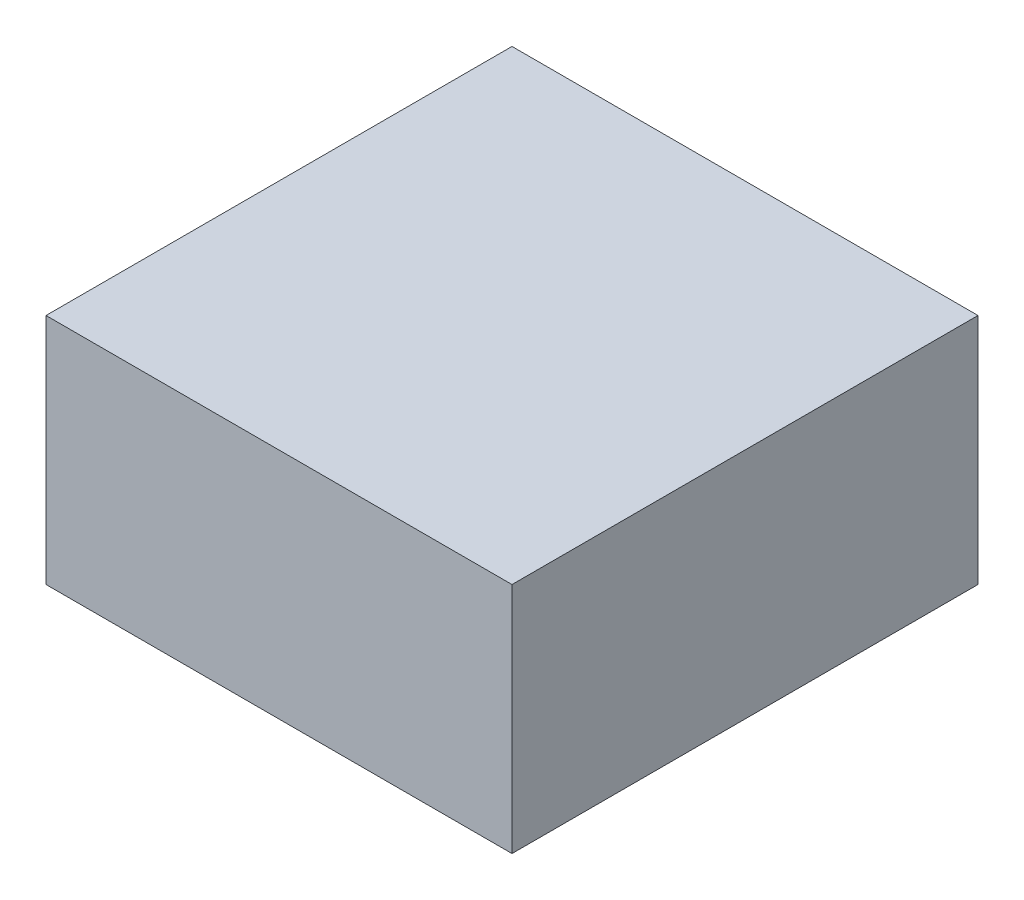
ISO-10303-21;
HEADER;
FILE_DESCRIPTION(('STEP AP214'),'2;1');
FILE_NAME('part.step','',(''),(''),'','','');
FILE_SCHEMA(('AUTOMOTIVE_DESIGN { 1 0 10303 214 1 1 1 1 }'));
ENDSEC;
DATA;
#1=APPLICATION_CONTEXT('core data for automotive mechanical design processes');
#2=APPLICATION_PROTOCOL_DEFINITION('international standard','automotive_design',2000,#1);
#3=PRODUCT_CONTEXT('',#1,'mechanical');
#4=PRODUCT('Part','Part','',(#3));
#5=PRODUCT_RELATED_PRODUCT_CATEGORY('part','',(#4));
#6=PRODUCT_DEFINITION_FORMATION('','',#4);
#7=PRODUCT_DEFINITION_CONTEXT('part definition',#1,'design');
#8=PRODUCT_DEFINITION('design','',#6,#7);
#9=PRODUCT_DEFINITION_SHAPE('','',#8);
#10=(LENGTH_UNIT() NAMED_UNIT(*) SI_UNIT(.MILLI.,.METRE.));
#11=(NAMED_UNIT(*) PLANE_ANGLE_UNIT() SI_UNIT($,.RADIAN.));
#12=(NAMED_UNIT(*) SI_UNIT($,.STERADIAN.) SOLID_ANGLE_UNIT());
#13=UNCERTAINTY_MEASURE_WITH_UNIT(LENGTH_MEASURE(1.E-05),#10,'distance_accuracy_value','');
#14=(GEOMETRIC_REPRESENTATION_CONTEXT(3) GLOBAL_UNCERTAINTY_ASSIGNED_CONTEXT((#13)) GLOBAL_UNIT_ASSIGNED_CONTEXT((#10,
#11,#12)) REPRESENTATION_CONTEXT('',''));
#15=CARTESIAN_POINT('',(0.,0.,0.));
#16=DIRECTION('',(0.,0.,1.));
#17=DIRECTION('',(1.,0.,0.));
#18=AXIS2_PLACEMENT_3D('',#15,#16,#17);
#19=CARTESIAN_POINT('',(40.64,114.947278349685,40.64));
#20=DIRECTION('',(0.,0.,1.));
#21=DIRECTION('',(1.,0.,0.));
#22=AXIS2_PLACEMENT_3D('',#19,#20,#21);
#23=PLANE('',#22);
#24=DIRECTION('',(1.,0.,0.));
#25=VECTOR('',#24,1.);
#26=CARTESIAN_POINT('',(40.64,-38.1,40.64));
#27=LINE('',#26,#25);
#28=CARTESIAN_POINT('',(-40.64,-38.1,40.64));
#29=VERTEX_POINT('',#28);
#30=CARTESIAN_POINT('',(40.64,-38.1,40.64));
#31=VERTEX_POINT('',#30);
#32=EDGE_CURVE('E234',#29,#31,#27,.T.);
#33=ORIENTED_EDGE('',*,*,#32,.T.);
#34=DIRECTION('',(0.,-1.,0.));
#35=VECTOR('',#34,1.);
#36=CARTESIAN_POINT('',(40.64,114.947278349685,40.64));
#37=LINE('',#36,#35);
#38=CARTESIAN_POINT('',(40.64,-43.18,40.64));
#39=VERTEX_POINT('',#38);
#40=EDGE_CURVE('E294',#31,#39,#37,.T.);
#41=ORIENTED_EDGE('',*,*,#40,.T.);
#42=DIRECTION('',(-1.,0.,0.));
#43=VECTOR('',#42,1.);
#44=CARTESIAN_POINT('',(40.64,-43.18,40.64));
#45=LINE('',#44,#43);
#46=CARTESIAN_POINT('',(-40.64,-43.18,40.64));
#47=VERTEX_POINT('',#46);
#48=EDGE_CURVE('E287',#39,#47,#45,.T.);
#49=ORIENTED_EDGE('',*,*,#48,.T.);
#50=DIRECTION('',(0.,-1.,0.));
#51=VECTOR('',#50,1.);
#52=CARTESIAN_POINT('',(-40.64,114.947278349685,40.64));
#53=LINE('',#52,#51);
#54=EDGE_CURVE('E283',#29,#47,#53,.T.);
#55=ORIENTED_EDGE('',*,*,#54,.F.);
#56=EDGE_LOOP('',(#33,#41,#49,#55));
#57=FACE_BOUND('',#56,.T.);
#58=ADVANCED_FACE('F37',(#57),#23,.F.);
#59=CARTESIAN_POINT('',(-40.64,114.947278349685,-40.64));
#60=DIRECTION('',(-1.,0.,0.));
#61=DIRECTION('',(0.,0.,1.));
#62=AXIS2_PLACEMENT_3D('',#59,#60,#61);
#63=PLANE('',#62);
#64=DIRECTION('',(0.,0.,1.));
#65=VECTOR('',#64,1.);
#66=CARTESIAN_POINT('',(-40.64,-38.1,-40.64));
#67=LINE('',#66,#65);
#68=CARTESIAN_POINT('',(-40.64,-38.1,-40.64));
#69=VERTEX_POINT('',#68);
#70=EDGE_CURVE('E62',#69,#29,#67,.T.);
#71=ORIENTED_EDGE('',*,*,#70,.T.);
#72=ORIENTED_EDGE('',*,*,#54,.T.);
#73=DIRECTION('',(0.,0.,-1.));
#74=VECTOR('',#73,1.);
#75=CARTESIAN_POINT('',(-40.64,-43.18,-40.64));
#76=LINE('',#75,#74);
#77=CARTESIAN_POINT('',(-40.64,-43.18,-40.64));
#78=VERTEX_POINT('',#77);
#79=EDGE_CURVE('E284',#47,#78,#76,.T.);
#80=ORIENTED_EDGE('',*,*,#79,.T.);
#81=DIRECTION('',(0.,-1.,0.));
#82=VECTOR('',#81,1.);
#83=CARTESIAN_POINT('',(-40.64,114.947278349685,-40.64));
#84=LINE('',#83,#82);
#85=EDGE_CURVE('E295',#69,#78,#84,.T.);
#86=ORIENTED_EDGE('',*,*,#85,.F.);
#87=EDGE_LOOP('',(#71,#72,#80,#86));
#88=FACE_BOUND('',#87,.T.);
#89=ADVANCED_FACE('F351',(#88),#63,.F.);
#90=CARTESIAN_POINT('',(40.64,114.947278349685,-40.64));
#91=DIRECTION('',(0.,0.,-1.));
#92=DIRECTION('',(-1.,0.,0.));
#93=AXIS2_PLACEMENT_3D('',#90,#91,#92);
#94=PLANE('',#93);
#95=DIRECTION('',(-1.,0.,0.));
#96=VECTOR('',#95,1.);
#97=CARTESIAN_POINT('',(40.64,-38.1,-40.64));
#98=LINE('',#97,#96);
#99=CARTESIAN_POINT('',(40.64,-38.1,-40.64));
#100=VERTEX_POINT('',#99);
#101=EDGE_CURVE('E239',#100,#69,#98,.T.);
#102=ORIENTED_EDGE('',*,*,#101,.T.);
#103=ORIENTED_EDGE('',*,*,#85,.T.);
#104=DIRECTION('',(1.,0.,0.));
#105=VECTOR('',#104,1.);
#106=CARTESIAN_POINT('',(40.64,-43.18,-40.64));
#107=LINE('',#106,#105);
#108=CARTESIAN_POINT('',(40.64,-43.18,-40.64));
#109=VERTEX_POINT('',#108);
#110=EDGE_CURVE('E280',#78,#109,#107,.T.);
#111=ORIENTED_EDGE('',*,*,#110,.T.);
#112=DIRECTION('',(0.,-1.,0.));
#113=VECTOR('',#112,1.);
#114=CARTESIAN_POINT('',(40.64,114.947278349685,-40.64));
#115=LINE('',#114,#113);
#116=EDGE_CURVE('E292',#100,#109,#115,.T.);
#117=ORIENTED_EDGE('',*,*,#116,.F.);
#118=EDGE_LOOP('',(#102,#103,#111,#117));
#119=FACE_BOUND('',#118,.T.);
#120=ADVANCED_FACE('F357',(#119),#94,.F.);
#121=CARTESIAN_POINT('',(40.64,114.947278349685,-40.64));
#122=DIRECTION('',(1.,0.,0.));
#123=DIRECTION('',(0.,0.,-1.));
#124=AXIS2_PLACEMENT_3D('',#121,#122,#123);
#125=PLANE('',#124);
#126=DIRECTION('',(0.,0.,-1.));
#127=VECTOR('',#126,1.);
#128=CARTESIAN_POINT('',(40.64,-38.1,-40.64));
#129=LINE('',#128,#127);
#130=EDGE_CURVE('E232',#31,#100,#129,.T.);
#131=ORIENTED_EDGE('',*,*,#130,.T.);
#132=ORIENTED_EDGE('',*,*,#116,.T.);
#133=DIRECTION('',(0.,0.,1.));
#134=VECTOR('',#133,1.);
#135=CARTESIAN_POINT('',(40.64,-43.18,-40.64));
#136=LINE('',#135,#134);
#137=EDGE_CURVE('E246',#109,#39,#136,.T.);
#138=ORIENTED_EDGE('',*,*,#137,.T.);
#139=ORIENTED_EDGE('',*,*,#40,.F.);
#140=EDGE_LOOP('',(#131,#132,#138,#139));
#141=FACE_BOUND('',#140,.T.);
#142=ADVANCED_FACE('F402',(#141),#125,.F.);
#143=CARTESIAN_POINT('',(-43.18,-43.18,-43.18));
#144=DIRECTION('',(-1.,0.,0.));
#145=DIRECTION('',(0.,0.,1.));
#146=AXIS2_PLACEMENT_3D('',#143,#144,#145);
#147=PLANE('',#146);
#148=CARTESIAN_POINT('',(-43.18,-10.16,0.));
#149=DIRECTION('',(-1.,0.,0.));
#150=DIRECTION('',(0.,0.,1.));
#151=AXIS2_PLACEMENT_3D('',#148,#149,#150);
#152=CIRCLE('',#151,1.905);
#153=CARTESIAN_POINT('',(-43.18,-10.16,1.905));
#154=VERTEX_POINT('',#153);
#155=EDGE_CURVE('E725',#154,#154,#152,.T.);
#156=ORIENTED_EDGE('',*,*,#155,.F.);
#157=EDGE_LOOP('',(#156));
#158=FACE_BOUND('',#157,.T.);
#159=CARTESIAN_POINT('',(-43.18,-18.1026223006332,-17.78));
#160=DIRECTION('',(-1.,0.,0.));
#161=DIRECTION('',(0.,0.,1.));
#162=AXIS2_PLACEMENT_3D('',#159,#160,#161);
#163=CIRCLE('',#162,6.35);
#164=CARTESIAN_POINT('',(-43.18,-18.1026223006332,-11.43));
#165=VERTEX_POINT('',#164);
#166=EDGE_CURVE('E733',#165,#165,#163,.T.);
#167=ORIENTED_EDGE('',*,*,#166,.F.);
#168=EDGE_LOOP('',(#167));
#169=FACE_BOUND('',#168,.T.);
#170=CARTESIAN_POINT('',(-43.18,-18.1026223006332,17.78));
#171=DIRECTION('',(-1.,0.,0.));
#172=DIRECTION('',(0.,0.,1.));
#173=AXIS2_PLACEMENT_3D('',#170,#171,#172);
#174=CIRCLE('',#173,6.35);
#175=CARTESIAN_POINT('',(-43.18,-18.1026223006332,24.13));
#176=VERTEX_POINT('',#175);
#177=EDGE_CURVE('E726',#176,#176,#174,.T.);
#178=ORIENTED_EDGE('',*,*,#177,.F.);
#179=EDGE_LOOP('',(#178));
#180=FACE_BOUND('',#179,.T.);
#181=CARTESIAN_POINT('',(-43.18,-27.94,0.));
#182=DIRECTION('',(-1.,0.,0.));
#183=DIRECTION('',(0.,0.,1.));
#184=AXIS2_PLACEMENT_3D('',#181,#182,#183);
#185=CIRCLE('',#184,6.35);
#186=CARTESIAN_POINT('',(-43.18,-27.94,6.35));
#187=VERTEX_POINT('',#186);
#188=EDGE_CURVE('E738',#187,#187,#185,.T.);
#189=ORIENTED_EDGE('',*,*,#188,.F.);
#190=EDGE_LOOP('',(#189));
#191=FACE_BOUND('',#190,.T.);
#192=DIRECTION('',(0.,0.,1.));
#193=VECTOR('',#192,1.);
#194=CARTESIAN_POINT('',(-43.18,0.,-43.18));
#195=LINE('',#194,#193);
#196=CARTESIAN_POINT('',(-43.18,0.,-43.18));
#197=VERTEX_POINT('',#196);
#198=CARTESIAN_POINT('',(-43.18,0.,43.18));
#199=VERTEX_POINT('',#198);
#200=EDGE_CURVE('E299',#197,#199,#195,.T.);
#201=ORIENTED_EDGE('',*,*,#200,.F.);
#202=DIRECTION('',(0.,1.,0.));
#203=VECTOR('',#202,1.);
#204=CARTESIAN_POINT('',(-43.18,-43.18,-43.18));
#205=LINE('',#204,#203);
#206=CARTESIAN_POINT('',(-43.18,-43.18,-43.18));
#207=VERTEX_POINT('',#206);
#208=EDGE_CURVE('E12',#207,#197,#205,.T.);
#209=ORIENTED_EDGE('',*,*,#208,.F.);
#210=DIRECTION('',(0.,0.,1.));
#211=VECTOR('',#210,1.);
#212=CARTESIAN_POINT('',(-43.18,-43.18,-43.18));
#213=LINE('',#212,#211);
#214=CARTESIAN_POINT('',(-43.18,-43.18,43.18));
#215=VERTEX_POINT('',#214);
#216=EDGE_CURVE('E300',#207,#215,#213,.T.);
#217=ORIENTED_EDGE('',*,*,#216,.T.);
#218=DIRECTION('',(0.,1.,0.));
#219=VECTOR('',#218,1.);
#220=CARTESIAN_POINT('',(-43.18,-43.18,43.18));
#221=LINE('',#220,#219);
#222=EDGE_CURVE('E41',#215,#199,#221,.T.);
#223=ORIENTED_EDGE('',*,*,#222,.T.);
#224=EDGE_LOOP('',(#201,#209,#217,#223));
#225=FACE_BOUND('',#224,.T.);
#226=ADVANCED_FACE('F39',(#158,#169,#180,#191,#225),#147,.T.);
#227=CARTESIAN_POINT('',(-43.18,-43.18,-43.18));
#228=DIRECTION('',(0.,0.,-1.));
#229=DIRECTION('',(-1.,0.,0.));
#230=AXIS2_PLACEMENT_3D('',#227,#228,#229);
#231=PLANE('',#230);
#232=DIRECTION('',(-1.,0.,0.));
#233=VECTOR('',#232,1.);
#234=CARTESIAN_POINT('',(-43.18,0.,-43.18));
#235=LINE('',#234,#233);
#236=CARTESIAN_POINT('',(43.18,0.,-43.18));
#237=VERTEX_POINT('',#236);
#238=EDGE_CURVE('E304',#237,#197,#235,.T.);
#239=ORIENTED_EDGE('',*,*,#238,.F.);
#240=DIRECTION('',(0.,1.,0.));
#241=VECTOR('',#240,1.);
#242=CARTESIAN_POINT('',(43.18,-43.18,-43.18));
#243=LINE('',#242,#241);
#244=CARTESIAN_POINT('',(43.18,-43.18,-43.18));
#245=VERTEX_POINT('',#244);
#246=EDGE_CURVE('E46',#245,#237,#243,.T.);
#247=ORIENTED_EDGE('',*,*,#246,.F.);
#248=DIRECTION('',(-1.,0.,0.));
#249=VECTOR('',#248,1.);
#250=CARTESIAN_POINT('',(-43.18,-43.18,-43.18));
#251=LINE('',#250,#249);
#252=EDGE_CURVE('E310',#245,#207,#251,.T.);
#253=ORIENTED_EDGE('',*,*,#252,.T.);
#254=ORIENTED_EDGE('',*,*,#208,.T.);
#255=EDGE_LOOP('',(#239,#247,#253,#254));
#256=FACE_BOUND('',#255,.T.);
#257=ADVANCED_FACE('F336',(#256),#231,.T.);
#258=CARTESIAN_POINT('',(43.18,-43.18,-43.18));
#259=DIRECTION('',(1.,0.,0.));
#260=DIRECTION('',(0.,0.,-1.));
#261=AXIS2_PLACEMENT_3D('',#258,#259,#260);
#262=PLANE('',#261);
#263=DIRECTION('',(0.,0.,-1.));
#264=VECTOR('',#263,1.);
#265=CARTESIAN_POINT('',(43.18,0.,-43.18));
#266=LINE('',#265,#264);
#267=CARTESIAN_POINT('',(43.18,0.,43.18));
#268=VERTEX_POINT('',#267);
#269=EDGE_CURVE('E318',#268,#237,#266,.T.);
#270=ORIENTED_EDGE('',*,*,#269,.F.);
#271=DIRECTION('',(0.,1.,0.));
#272=VECTOR('',#271,1.);
#273=CARTESIAN_POINT('',(43.18,-43.18,43.18));
#274=LINE('',#273,#272);
#275=CARTESIAN_POINT('',(43.18,-43.18,43.18));
#276=VERTEX_POINT('',#275);
#277=EDGE_CURVE('E323',#276,#268,#274,.T.);
#278=ORIENTED_EDGE('',*,*,#277,.F.);
#279=DIRECTION('',(0.,0.,-1.));
#280=VECTOR('',#279,1.);
#281=CARTESIAN_POINT('',(43.18,-43.18,-43.18));
#282=LINE('',#281,#280);
#283=EDGE_CURVE('E307',#276,#245,#282,.T.);
#284=ORIENTED_EDGE('',*,*,#283,.T.);
#285=ORIENTED_EDGE('',*,*,#246,.T.);
#286=EDGE_LOOP('',(#270,#278,#284,#285));
#287=FACE_BOUND('',#286,.T.);
#288=ADVANCED_FACE('F342',(#287),#262,.T.);
#289=CARTESIAN_POINT('',(-43.18,-43.18,43.18));
#290=DIRECTION('',(0.,0.,1.));
#291=DIRECTION('',(1.,0.,0.));
#292=AXIS2_PLACEMENT_3D('',#289,#290,#291);
#293=PLANE('',#292);
#294=DIRECTION('',(1.,0.,0.));
#295=VECTOR('',#294,1.);
#296=CARTESIAN_POINT('',(-43.18,0.,43.18));
#297=LINE('',#296,#295);
#298=EDGE_CURVE('E315',#199,#268,#297,.T.);
#299=ORIENTED_EDGE('',*,*,#298,.F.);
#300=ORIENTED_EDGE('',*,*,#222,.F.);
#301=DIRECTION('',(1.,0.,0.));
#302=VECTOR('',#301,1.);
#303=CARTESIAN_POINT('',(-43.18,-43.18,43.18));
#304=LINE('',#303,#302);
#305=EDGE_CURVE('E303',#215,#276,#304,.T.);
#306=ORIENTED_EDGE('',*,*,#305,.T.);
#307=ORIENTED_EDGE('',*,*,#277,.T.);
#308=EDGE_LOOP('',(#299,#300,#306,#307));
#309=FACE_BOUND('',#308,.T.);
#310=ADVANCED_FACE('F331',(#309),#293,.T.);
#311=CARTESIAN_POINT('',(0.,-43.18,0.));
#312=DIRECTION('',(0.,1.,0.));
#313=DIRECTION('',(0.,0.,1.));
#314=AXIS2_PLACEMENT_3D('',#311,#312,#313);
#315=PLANE('',#314);
#316=ORIENTED_EDGE('',*,*,#79,.F.);
#317=ORIENTED_EDGE('',*,*,#48,.F.);
#318=ORIENTED_EDGE('',*,*,#137,.F.);
#319=ORIENTED_EDGE('',*,*,#110,.F.);
#320=EDGE_LOOP('',(#316,#317,#318,#319));
#321=FACE_BOUND('',#320,.T.);
#322=ORIENTED_EDGE('',*,*,#216,.F.);
#323=ORIENTED_EDGE('',*,*,#252,.F.);
#324=ORIENTED_EDGE('',*,*,#283,.F.);
#325=ORIENTED_EDGE('',*,*,#305,.F.);
#326=EDGE_LOOP('',(#322,#323,#324,#325));
#327=FACE_BOUND('',#326,.T.);
#328=ADVANCED_FACE('F339',(#321,#327),#315,.F.);
#329=CARTESIAN_POINT('',(0.,0.,0.));
#330=DIRECTION('',(0.,1.,0.));
#331=DIRECTION('',(0.,0.,1.));
#332=AXIS2_PLACEMENT_3D('',#329,#330,#331);
#333=PLANE('',#332);
#334=ORIENTED_EDGE('',*,*,#200,.T.);
#335=ORIENTED_EDGE('',*,*,#298,.T.);
#336=ORIENTED_EDGE('',*,*,#269,.T.);
#337=ORIENTED_EDGE('',*,*,#238,.T.);
#338=EDGE_LOOP('',(#334,#335,#336,#337));
#339=FACE_BOUND('',#338,.T.);
#340=ADVANCED_FACE('F333',(#339),#333,.T.);
#341=CARTESIAN_POINT('',(35.56,-158.127278349685,-27.94));
#342=DIRECTION('',(0.,1.,0.));
#343=DIRECTION('',(0.,0.,1.));
#344=AXIS2_PLACEMENT_3D('',#341,#342,#343);
#345=CYLINDRICAL_SURFACE('',#344,2.54);
#346=CARTESIAN_POINT('',(35.56,-38.1,-27.94));
#347=DIRECTION('',(0.,1.,0.));
#348=DIRECTION('',(0.,0.,1.));
#349=AXIS2_PLACEMENT_3D('',#346,#347,#348);
#350=CIRCLE('',#349,2.54);
#351=CARTESIAN_POINT('',(38.1,-38.1,-27.94));
#352=VERTEX_POINT('',#351);
#353=CARTESIAN_POINT('',(35.56,-38.1,-30.48));
#354=VERTEX_POINT('',#353);
#355=EDGE_CURVE('E207',#352,#354,#350,.T.);
#356=ORIENTED_EDGE('',*,*,#355,.F.);
#357=DIRECTION('',(0.,1.,0.));
#358=VECTOR('',#357,1.);
#359=CARTESIAN_POINT('',(38.1,-158.127278349685,-27.94));
#360=LINE('',#359,#358);
#361=CARTESIAN_POINT('',(38.1,-7.62,-27.94));
#362=VERTEX_POINT('',#361);
#363=EDGE_CURVE('E241',#352,#362,#360,.T.);
#364=ORIENTED_EDGE('',*,*,#363,.T.);
#365=CARTESIAN_POINT('',(35.56,-7.62,-27.94));
#366=DIRECTION('',(0.,-1.,0.));
#367=DIRECTION('',(0.,0.,-1.));
#368=AXIS2_PLACEMENT_3D('',#365,#366,#367);
#369=CIRCLE('',#368,2.54);
#370=CARTESIAN_POINT('',(35.56,-7.61999999999999,-30.48));
#371=VERTEX_POINT('',#370);
#372=EDGE_CURVE('E54',#371,#362,#369,.T.);
#373=ORIENTED_EDGE('',*,*,#372,.F.);
#374=DIRECTION('',(0.,1.,0.));
#375=VECTOR('',#374,1.);
#376=CARTESIAN_POINT('',(35.56,-158.127278349685,-30.48));
#377=LINE('',#376,#375);
#378=EDGE_CURVE('E224',#354,#371,#377,.T.);
#379=ORIENTED_EDGE('',*,*,#378,.F.);
#380=EDGE_LOOP('',(#356,#364,#373,#379));
#381=FACE_BOUND('',#380,.T.);
#382=ADVANCED_FACE('F372',(#381),#345,.F.);
#383=CARTESIAN_POINT('',(38.1,-158.127278349685,27.94));
#384=DIRECTION('',(-1.,0.,0.));
#385=DIRECTION('',(0.,0.,1.));
#386=AXIS2_PLACEMENT_3D('',#383,#384,#385);
#387=PLANE('',#386);
#388=DIRECTION('',(0.,0.,-1.));
#389=VECTOR('',#388,1.);
#390=CARTESIAN_POINT('',(38.1,-38.1,27.94));
#391=LINE('',#390,#389);
#392=CARTESIAN_POINT('',(38.1,-38.1,27.94));
#393=VERTEX_POINT('',#392);
#394=EDGE_CURVE('E244',#393,#352,#391,.T.);
#395=ORIENTED_EDGE('',*,*,#394,.F.);
#396=DIRECTION('',(0.,1.,0.));
#397=VECTOR('',#396,1.);
#398=CARTESIAN_POINT('',(38.1,-158.127278349685,27.94));
#399=LINE('',#398,#397);
#400=CARTESIAN_POINT('',(38.1,-7.62,27.94));
#401=VERTEX_POINT('',#400);
#402=EDGE_CURVE('E802',#393,#401,#399,.T.);
#403=ORIENTED_EDGE('',*,*,#402,.T.);
#404=DIRECTION('',(0.,0.,1.));
#405=VECTOR('',#404,1.);
#406=CARTESIAN_POINT('',(38.1,-7.62,27.94));
#407=LINE('',#406,#405);
#408=EDGE_CURVE('E787',#362,#401,#407,.T.);
#409=ORIENTED_EDGE('',*,*,#408,.F.);
#410=ORIENTED_EDGE('',*,*,#363,.F.);
#411=EDGE_LOOP('',(#395,#403,#409,#410));
#412=FACE_BOUND('',#411,.T.);
#413=ADVANCED_FACE('F376',(#412),#387,.T.);
#414=CARTESIAN_POINT('',(35.56,-158.127278349685,27.94));
#415=DIRECTION('',(0.,1.,0.));
#416=DIRECTION('',(0.,0.,1.));
#417=AXIS2_PLACEMENT_3D('',#414,#415,#416);
#418=CYLINDRICAL_SURFACE('',#417,2.54);
#419=CARTESIAN_POINT('',(35.56,-38.1,27.94));
#420=DIRECTION('',(0.,1.,0.));
#421=DIRECTION('',(0.,0.,1.));
#422=AXIS2_PLACEMENT_3D('',#419,#420,#421);
#423=CIRCLE('',#422,2.54);
#424=CARTESIAN_POINT('',(35.56,-38.1,30.48));
#425=VERTEX_POINT('',#424);
#426=EDGE_CURVE('E247',#425,#393,#423,.T.);
#427=ORIENTED_EDGE('',*,*,#426,.F.);
#428=DIRECTION('',(0.,1.,0.));
#429=VECTOR('',#428,1.);
#430=CARTESIAN_POINT('',(35.56,-158.127278349685,30.48));
#431=LINE('',#430,#429);
#432=CARTESIAN_POINT('',(35.56,-7.62,30.48));
#433=VERTEX_POINT('',#432);
#434=EDGE_CURVE('E804',#425,#433,#431,.T.);
#435=ORIENTED_EDGE('',*,*,#434,.T.);
#436=CARTESIAN_POINT('',(35.56,-7.62,27.94));
#437=DIRECTION('',(0.,-1.,0.));
#438=DIRECTION('',(0.,0.,1.));
#439=AXIS2_PLACEMENT_3D('',#436,#437,#438);
#440=CIRCLE('',#439,2.54);
#441=EDGE_CURVE('E784',#401,#433,#440,.T.);
#442=ORIENTED_EDGE('',*,*,#441,.F.);
#443=ORIENTED_EDGE('',*,*,#402,.F.);
#444=EDGE_LOOP('',(#427,#435,#442,#443));
#445=FACE_BOUND('',#444,.T.);
#446=ADVANCED_FACE('F381',(#445),#418,.F.);
#447=CARTESIAN_POINT('',(35.56,-158.127278349685,35.56));
#448=DIRECTION('',(0.,1.,0.));
#449=DIRECTION('',(0.,0.,1.));
#450=AXIS2_PLACEMENT_3D('',#447,#448,#449);
#451=CYLINDRICAL_SURFACE('',#450,5.08);
#452=CARTESIAN_POINT('',(35.56,-38.1,35.56));
#453=DIRECTION('',(0.,1.,0.));
#454=DIRECTION('',(0.,0.,1.));
#455=AXIS2_PLACEMENT_3D('',#452,#453,#454);
#456=CIRCLE('',#455,5.08);
#457=CARTESIAN_POINT('',(30.48,-38.1,35.56));
#458=VERTEX_POINT('',#457);
#459=EDGE_CURVE('E249',#458,#425,#456,.F.);
#460=ORIENTED_EDGE('',*,*,#459,.F.);
#461=DIRECTION('',(0.,1.,0.));
#462=VECTOR('',#461,1.);
#463=CARTESIAN_POINT('',(30.48,-158.127278349685,35.56));
#464=LINE('',#463,#462);
#465=CARTESIAN_POINT('',(30.48,-7.62,35.56));
#466=VERTEX_POINT('',#465);
#467=EDGE_CURVE('E806',#458,#466,#464,.T.);
#468=ORIENTED_EDGE('',*,*,#467,.T.);
#469=CARTESIAN_POINT('',(35.56,-7.62,35.56));
#470=DIRECTION('',(0.,1.,0.));
#471=DIRECTION('',(0.,0.,-1.));
#472=AXIS2_PLACEMENT_3D('',#469,#470,#471);
#473=CIRCLE('',#472,5.08);
#474=EDGE_CURVE('E781',#433,#466,#473,.T.);
#475=ORIENTED_EDGE('',*,*,#474,.F.);
#476=ORIENTED_EDGE('',*,*,#434,.F.);
#477=EDGE_LOOP('',(#460,#468,#475,#476));
#478=FACE_BOUND('',#477,.T.);
#479=ADVANCED_FACE('F525',(#478),#451,.T.);
#480=CARTESIAN_POINT('',(27.94,-158.127278349685,35.56));
#481=DIRECTION('',(0.,1.,0.));
#482=DIRECTION('',(0.,0.,1.));
#483=AXIS2_PLACEMENT_3D('',#480,#481,#482);
#484=CYLINDRICAL_SURFACE('',#483,2.54);
#485=CARTESIAN_POINT('',(27.94,-38.1,35.56));
#486=DIRECTION('',(0.,1.,0.));
#487=DIRECTION('',(0.,0.,1.));
#488=AXIS2_PLACEMENT_3D('',#485,#486,#487);
#489=CIRCLE('',#488,2.54);
#490=CARTESIAN_POINT('',(27.94,-38.1,38.1));
#491=VERTEX_POINT('',#490);
#492=EDGE_CURVE('E251',#491,#458,#489,.T.);
#493=ORIENTED_EDGE('',*,*,#492,.F.);
#494=DIRECTION('',(0.,1.,0.));
#495=VECTOR('',#494,1.);
#496=CARTESIAN_POINT('',(27.94,-158.127278349685,38.1));
#497=LINE('',#496,#495);
#498=CARTESIAN_POINT('',(27.94,-7.62,38.1));
#499=VERTEX_POINT('',#498);
#500=EDGE_CURVE('E808',#491,#499,#497,.T.);
#501=ORIENTED_EDGE('',*,*,#500,.T.);
#502=CARTESIAN_POINT('',(27.94,-7.62,35.56));
#503=DIRECTION('',(0.,-1.,0.));
#504=DIRECTION('',(0.,0.,-1.));
#505=AXIS2_PLACEMENT_3D('',#502,#503,#504);
#506=CIRCLE('',#505,2.54);
#507=EDGE_CURVE('E778',#466,#499,#506,.T.);
#508=ORIENTED_EDGE('',*,*,#507,.F.);
#509=ORIENTED_EDGE('',*,*,#467,.F.);
#510=EDGE_LOOP('',(#493,#501,#508,#509));
#511=FACE_BOUND('',#510,.T.);
#512=ADVANCED_FACE('F533',(#511),#484,.F.);
#513=CARTESIAN_POINT('',(-27.94,-158.127278349685,38.1));
#514=DIRECTION('',(0.,0.,-1.));
#515=DIRECTION('',(-1.,0.,0.));
#516=AXIS2_PLACEMENT_3D('',#513,#514,#515);
#517=PLANE('',#516);
#518=DIRECTION('',(1.,0.,0.));
#519=VECTOR('',#518,1.);
#520=CARTESIAN_POINT('',(-27.94,-38.1,38.1));
#521=LINE('',#520,#519);
#522=CARTESIAN_POINT('',(-27.94,-38.1,38.1));
#523=VERTEX_POINT('',#522);
#524=EDGE_CURVE('E253',#523,#491,#521,.T.);
#525=ORIENTED_EDGE('',*,*,#524,.F.);
#526=DIRECTION('',(0.,1.,0.));
#527=VECTOR('',#526,1.);
#528=CARTESIAN_POINT('',(-27.94,-158.127278349685,38.1));
#529=LINE('',#528,#527);
#530=CARTESIAN_POINT('',(-27.94,-7.62,38.1));
#531=VERTEX_POINT('',#530);
#532=EDGE_CURVE('E810',#523,#531,#529,.T.);
#533=ORIENTED_EDGE('',*,*,#532,.T.);
#534=DIRECTION('',(-1.,0.,0.));
#535=VECTOR('',#534,1.);
#536=CARTESIAN_POINT('',(-27.94,-7.62,38.1));
#537=LINE('',#536,#535);
#538=EDGE_CURVE('E775',#499,#531,#537,.T.);
#539=ORIENTED_EDGE('',*,*,#538,.F.);
#540=ORIENTED_EDGE('',*,*,#500,.F.);
#541=EDGE_LOOP('',(#525,#533,#539,#540));
#542=FACE_BOUND('',#541,.T.);
#543=ADVANCED_FACE('F542',(#542),#517,.T.);
#544=CARTESIAN_POINT('',(-27.94,-158.127278349685,35.56));
#545=DIRECTION('',(0.,1.,0.));
#546=DIRECTION('',(0.,0.,1.));
#547=AXIS2_PLACEMENT_3D('',#544,#545,#546);
#548=CYLINDRICAL_SURFACE('',#547,2.54000000000001);
#549=CARTESIAN_POINT('',(-27.94,-38.1,35.56));
#550=DIRECTION('',(0.,1.,0.));
#551=DIRECTION('',(0.,0.,1.));
#552=AXIS2_PLACEMENT_3D('',#549,#550,#551);
#553=CIRCLE('',#552,2.54000000000001);
#554=CARTESIAN_POINT('',(-30.48,-38.1,35.56));
#555=VERTEX_POINT('',#554);
#556=EDGE_CURVE('E255',#555,#523,#553,.T.);
#557=ORIENTED_EDGE('',*,*,#556,.F.);
#558=DIRECTION('',(0.,1.,0.));
#559=VECTOR('',#558,1.);
#560=CARTESIAN_POINT('',(-30.48,-158.127278349685,35.56));
#561=LINE('',#560,#559);
#562=CARTESIAN_POINT('',(-30.48,-7.62,35.56));
#563=VERTEX_POINT('',#562);
#564=EDGE_CURVE('E812',#555,#563,#561,.T.);
#565=ORIENTED_EDGE('',*,*,#564,.T.);
#566=CARTESIAN_POINT('',(-27.94,-7.62,35.56));
#567=DIRECTION('',(0.,-1.,0.));
#568=DIRECTION('',(0.,0.,1.));
#569=AXIS2_PLACEMENT_3D('',#566,#567,#568);
#570=CIRCLE('',#569,2.54000000000001);
#571=EDGE_CURVE('E772',#531,#563,#570,.T.);
#572=ORIENTED_EDGE('',*,*,#571,.F.);
#573=ORIENTED_EDGE('',*,*,#532,.F.);
#574=EDGE_LOOP('',(#557,#565,#572,#573));
#575=FACE_BOUND('',#574,.T.);
#576=ADVANCED_FACE('F551',(#575),#548,.F.);
#577=CARTESIAN_POINT('',(-35.56,-158.127278349685,35.56));
#578=DIRECTION('',(0.,1.,0.));
#579=DIRECTION('',(0.,0.,1.));
#580=AXIS2_PLACEMENT_3D('',#577,#578,#579);
#581=CYLINDRICAL_SURFACE('',#580,5.08);
#582=CARTESIAN_POINT('',(-35.56,-38.1,35.56));
#583=DIRECTION('',(0.,1.,0.));
#584=DIRECTION('',(0.,0.,1.));
#585=AXIS2_PLACEMENT_3D('',#582,#583,#584);
#586=CIRCLE('',#585,5.08);
#587=CARTESIAN_POINT('',(-35.56,-38.1,30.48));
#588=VERTEX_POINT('',#587);
#589=EDGE_CURVE('E257',#588,#555,#586,.F.);
#590=ORIENTED_EDGE('',*,*,#589,.F.);
#591=DIRECTION('',(0.,1.,0.));
#592=VECTOR('',#591,1.);
#593=CARTESIAN_POINT('',(-35.56,-158.127278349685,30.48));
#594=LINE('',#593,#592);
#595=CARTESIAN_POINT('',(-35.56,-7.62,30.48));
#596=VERTEX_POINT('',#595);
#597=EDGE_CURVE('E814',#588,#596,#594,.T.);
#598=ORIENTED_EDGE('',*,*,#597,.T.);
#599=CARTESIAN_POINT('',(-35.56,-7.62,35.56));
#600=DIRECTION('',(0.,1.,0.));
#601=DIRECTION('',(0.,0.,-1.));
#602=AXIS2_PLACEMENT_3D('',#599,#600,#601);
#603=CIRCLE('',#602,5.08);
#604=EDGE_CURVE('E769',#563,#596,#603,.T.);
#605=ORIENTED_EDGE('',*,*,#604,.F.);
#606=ORIENTED_EDGE('',*,*,#564,.F.);
#607=EDGE_LOOP('',(#590,#598,#605,#606));
#608=FACE_BOUND('',#607,.T.);
#609=ADVANCED_FACE('F560',(#608),#581,.T.);
#610=CARTESIAN_POINT('',(-35.56,-158.127278349685,27.94));
#611=DIRECTION('',(0.,1.,0.));
#612=DIRECTION('',(0.,0.,1.));
#613=AXIS2_PLACEMENT_3D('',#610,#611,#612);
#614=CYLINDRICAL_SURFACE('',#613,2.54);
#615=CARTESIAN_POINT('',(-35.56,-38.1,27.94));
#616=DIRECTION('',(0.,1.,0.));
#617=DIRECTION('',(0.,0.,1.));
#618=AXIS2_PLACEMENT_3D('',#615,#616,#617);
#619=CIRCLE('',#618,2.54);
#620=CARTESIAN_POINT('',(-38.1,-38.1,27.94));
#621=VERTEX_POINT('',#620);
#622=EDGE_CURVE('E259',#621,#588,#619,.T.);
#623=ORIENTED_EDGE('',*,*,#622,.F.);
#624=DIRECTION('',(0.,1.,0.));
#625=VECTOR('',#624,1.);
#626=CARTESIAN_POINT('',(-38.1,-158.127278349685,27.94));
#627=LINE('',#626,#625);
#628=CARTESIAN_POINT('',(-38.1,-7.62,27.94));
#629=VERTEX_POINT('',#628);
#630=EDGE_CURVE('E816',#621,#629,#627,.T.);
#631=ORIENTED_EDGE('',*,*,#630,.T.);
#632=CARTESIAN_POINT('',(-35.56,-7.62,27.94));
#633=DIRECTION('',(0.,-1.,0.));
#634=DIRECTION('',(0.,0.,-1.));
#635=AXIS2_PLACEMENT_3D('',#632,#633,#634);
#636=CIRCLE('',#635,2.54);
#637=EDGE_CURVE('E766',#596,#629,#636,.T.);
#638=ORIENTED_EDGE('',*,*,#637,.F.);
#639=ORIENTED_EDGE('',*,*,#597,.F.);
#640=EDGE_LOOP('',(#623,#631,#638,#639));
#641=FACE_BOUND('',#640,.T.);
#642=ADVANCED_FACE('F569',(#641),#614,.F.);
#643=CARTESIAN_POINT('',(-38.1,-158.127278349685,-27.94));
#644=DIRECTION('',(1.,0.,0.));
#645=DIRECTION('',(0.,0.,-1.));
#646=AXIS2_PLACEMENT_3D('',#643,#644,#645);
#647=PLANE('',#646);
#648=CARTESIAN_POINT('',(-38.1,-10.16,0.));
#649=DIRECTION('',(1.,0.,0.));
#650=DIRECTION('',(0.,0.,-1.));
#651=AXIS2_PLACEMENT_3D('',#648,#649,#650);
#652=CIRCLE('',#651,1.905);
#653=CARTESIAN_POINT('',(-38.1,-10.16,-1.905));
#654=VERTEX_POINT('',#653);
#655=EDGE_CURVE('E722',#654,#654,#652,.F.);
#656=ORIENTED_EDGE('',*,*,#655,.T.);
#657=EDGE_LOOP('',(#656));
#658=FACE_BOUND('',#657,.T.);
#659=CARTESIAN_POINT('',(-38.1,-18.1026223006332,-17.78));
#660=DIRECTION('',(1.,0.,0.));
#661=DIRECTION('',(0.,0.,-1.));
#662=AXIS2_PLACEMENT_3D('',#659,#660,#661);
#663=CIRCLE('',#662,6.35);
#664=CARTESIAN_POINT('',(-38.1,-18.1026223006332,-24.13));
#665=VERTEX_POINT('',#664);
#666=EDGE_CURVE('E736',#665,#665,#663,.F.);
#667=ORIENTED_EDGE('',*,*,#666,.T.);
#668=EDGE_LOOP('',(#667));
#669=FACE_BOUND('',#668,.T.);
#670=CARTESIAN_POINT('',(-38.1,-18.1026223006332,17.78));
#671=DIRECTION('',(1.,0.,0.));
#672=DIRECTION('',(0.,0.,-1.));
#673=AXIS2_PLACEMENT_3D('',#670,#671,#672);
#674=CIRCLE('',#673,6.35);
#675=CARTESIAN_POINT('',(-38.1,-18.1026223006332,11.43));
#676=VERTEX_POINT('',#675);
#677=EDGE_CURVE('E729',#676,#676,#674,.F.);
#678=ORIENTED_EDGE('',*,*,#677,.T.);
#679=EDGE_LOOP('',(#678));
#680=FACE_BOUND('',#679,.T.);
#681=CARTESIAN_POINT('',(-38.1,-27.94,0.));
#682=DIRECTION('',(1.,0.,0.));
#683=DIRECTION('',(0.,0.,-1.));
#684=AXIS2_PLACEMENT_3D('',#681,#682,#683);
#685=CIRCLE('',#684,6.35);
#686=CARTESIAN_POINT('',(-38.1,-27.94,-6.35));
#687=VERTEX_POINT('',#686);
#688=EDGE_CURVE('E744',#687,#687,#685,.F.);
#689=ORIENTED_EDGE('',*,*,#688,.T.);
#690=EDGE_LOOP('',(#689));
#691=FACE_BOUND('',#690,.T.);
#692=DIRECTION('',(0.,0.,1.));
#693=VECTOR('',#692,1.);
#694=CARTESIAN_POINT('',(-38.1,-38.1,-27.94));
#695=LINE('',#694,#693);
#696=CARTESIAN_POINT('',(-38.1,-38.1,-27.94));
#697=VERTEX_POINT('',#696);
#698=EDGE_CURVE('E261',#697,#621,#695,.T.);
#699=ORIENTED_EDGE('',*,*,#698,.F.);
#700=DIRECTION('',(0.,1.,0.));
#701=VECTOR('',#700,1.);
#702=CARTESIAN_POINT('',(-38.1,-158.127278349685,-27.94));
#703=LINE('',#702,#701);
#704=CARTESIAN_POINT('',(-38.1,-7.62,-27.94));
#705=VERTEX_POINT('',#704);
#706=EDGE_CURVE('E818',#697,#705,#703,.T.);
#707=ORIENTED_EDGE('',*,*,#706,.T.);
#708=DIRECTION('',(0.,0.,-1.));
#709=VECTOR('',#708,1.);
#710=CARTESIAN_POINT('',(-38.1,-7.62,-27.94));
#711=LINE('',#710,#709);
#712=EDGE_CURVE('E763',#629,#705,#711,.T.);
#713=ORIENTED_EDGE('',*,*,#712,.F.);
#714=ORIENTED_EDGE('',*,*,#630,.F.);
#715=EDGE_LOOP('',(#699,#707,#713,#714));
#716=FACE_BOUND('',#715,.T.);
#717=ADVANCED_FACE('F578',(#658,#669,#680,#691,#716),#647,.T.);
#718=CARTESIAN_POINT('',(-35.56,-158.127278349685,-27.94));
#719=DIRECTION('',(0.,1.,0.));
#720=DIRECTION('',(0.,0.,1.));
#721=AXIS2_PLACEMENT_3D('',#718,#719,#720);
#722=CYLINDRICAL_SURFACE('',#721,2.54);
#723=CARTESIAN_POINT('',(-35.56,-38.1,-27.94));
#724=DIRECTION('',(0.,1.,0.));
#725=DIRECTION('',(0.,0.,1.));
#726=AXIS2_PLACEMENT_3D('',#723,#724,#725);
#727=CIRCLE('',#726,2.54);
#728=CARTESIAN_POINT('',(-35.56,-38.1,-30.48));
#729=VERTEX_POINT('',#728);
#730=EDGE_CURVE('E263',#729,#697,#727,.T.);
#731=ORIENTED_EDGE('',*,*,#730,.F.);
#732=DIRECTION('',(0.,1.,0.));
#733=VECTOR('',#732,1.);
#734=CARTESIAN_POINT('',(-35.56,-158.127278349685,-30.48));
#735=LINE('',#734,#733);
#736=CARTESIAN_POINT('',(-35.56,-7.62,-30.48));
#737=VERTEX_POINT('',#736);
#738=EDGE_CURVE('E820',#729,#737,#735,.T.);
#739=ORIENTED_EDGE('',*,*,#738,.T.);
#740=CARTESIAN_POINT('',(-35.56,-7.62,-27.94));
#741=DIRECTION('',(0.,-1.,0.));
#742=DIRECTION('',(0.,0.,1.));
#743=AXIS2_PLACEMENT_3D('',#740,#741,#742);
#744=CIRCLE('',#743,2.54);
#745=EDGE_CURVE('E760',#705,#737,#744,.T.);
#746=ORIENTED_EDGE('',*,*,#745,.F.);
#747=ORIENTED_EDGE('',*,*,#706,.F.);
#748=EDGE_LOOP('',(#731,#739,#746,#747));
#749=FACE_BOUND('',#748,.T.);
#750=ADVANCED_FACE('F587',(#749),#722,.F.);
#751=CARTESIAN_POINT('',(-35.56,-158.127278349685,-35.56));
#752=DIRECTION('',(0.,1.,0.));
#753=DIRECTION('',(0.,0.,1.));
#754=AXIS2_PLACEMENT_3D('',#751,#752,#753);
#755=CYLINDRICAL_SURFACE('',#754,5.08);
#756=CARTESIAN_POINT('',(-35.56,-38.1,-35.56));
#757=DIRECTION('',(0.,1.,0.));
#758=DIRECTION('',(0.,0.,1.));
#759=AXIS2_PLACEMENT_3D('',#756,#757,#758);
#760=CIRCLE('',#759,5.08);
#761=CARTESIAN_POINT('',(-30.48,-38.1,-35.56));
#762=VERTEX_POINT('',#761);
#763=EDGE_CURVE('E265',#762,#729,#760,.F.);
#764=ORIENTED_EDGE('',*,*,#763,.F.);
#765=DIRECTION('',(0.,1.,0.));
#766=VECTOR('',#765,1.);
#767=CARTESIAN_POINT('',(-30.48,-158.127278349685,-35.56));
#768=LINE('',#767,#766);
#769=CARTESIAN_POINT('',(-30.48,-7.62,-35.56));
#770=VERTEX_POINT('',#769);
#771=EDGE_CURVE('E822',#762,#770,#768,.T.);
#772=ORIENTED_EDGE('',*,*,#771,.T.);
#773=CARTESIAN_POINT('',(-35.56,-7.62,-35.56));
#774=DIRECTION('',(0.,1.,0.));
#775=DIRECTION('',(0.,0.,-1.));
#776=AXIS2_PLACEMENT_3D('',#773,#774,#775);
#777=CIRCLE('',#776,5.08);
#778=EDGE_CURVE('E757',#737,#770,#777,.T.);
#779=ORIENTED_EDGE('',*,*,#778,.F.);
#780=ORIENTED_EDGE('',*,*,#738,.F.);
#781=EDGE_LOOP('',(#764,#772,#779,#780));
#782=FACE_BOUND('',#781,.T.);
#783=ADVANCED_FACE('F595',(#782),#755,.T.);
#784=CARTESIAN_POINT('',(-27.94,-158.127278349685,-35.56));
#785=DIRECTION('',(0.,1.,0.));
#786=DIRECTION('',(0.,0.,1.));
#787=AXIS2_PLACEMENT_3D('',#784,#785,#786);
#788=CYLINDRICAL_SURFACE('',#787,2.54);
#789=CARTESIAN_POINT('',(-27.94,-38.1,-35.56));
#790=DIRECTION('',(0.,1.,0.));
#791=DIRECTION('',(0.,0.,1.));
#792=AXIS2_PLACEMENT_3D('',#789,#790,#791);
#793=CIRCLE('',#792,2.54);
#794=CARTESIAN_POINT('',(-27.94,-38.1,-38.1));
#795=VERTEX_POINT('',#794);
#796=EDGE_CURVE('E267',#795,#762,#793,.T.);
#797=ORIENTED_EDGE('',*,*,#796,.F.);
#798=DIRECTION('',(0.,1.,0.));
#799=VECTOR('',#798,1.);
#800=CARTESIAN_POINT('',(-27.94,-158.127278349685,-38.1));
#801=LINE('',#800,#799);
#802=CARTESIAN_POINT('',(-27.94,-7.62,-38.1));
#803=VERTEX_POINT('',#802);
#804=EDGE_CURVE('E228',#795,#803,#801,.T.);
#805=ORIENTED_EDGE('',*,*,#804,.T.);
#806=CARTESIAN_POINT('',(-27.94,-7.62,-35.56));
#807=DIRECTION('',(0.,-1.,0.));
#808=DIRECTION('',(0.,0.,-1.));
#809=AXIS2_PLACEMENT_3D('',#806,#807,#808);
#810=CIRCLE('',#809,2.54);
#811=EDGE_CURVE('E754',#770,#803,#810,.T.);
#812=ORIENTED_EDGE('',*,*,#811,.F.);
#813=ORIENTED_EDGE('',*,*,#771,.F.);
#814=EDGE_LOOP('',(#797,#805,#812,#813));
#815=FACE_BOUND('',#814,.T.);
#816=ADVANCED_FACE('F604',(#815),#788,.F.);
#817=CARTESIAN_POINT('',(27.94,-158.127278349685,-38.1));
#818=DIRECTION('',(0.,0.,1.));
#819=DIRECTION('',(1.,0.,0.));
#820=AXIS2_PLACEMENT_3D('',#817,#818,#819);
#821=PLANE('',#820);
#822=DIRECTION('',(-1.,0.,0.));
#823=VECTOR('',#822,1.);
#824=CARTESIAN_POINT('',(27.94,-38.1,-38.1));
#825=LINE('',#824,#823);
#826=CARTESIAN_POINT('',(27.94,-38.1,-38.1));
#827=VERTEX_POINT('',#826);
#828=EDGE_CURVE('E218',#827,#795,#825,.T.);
#829=ORIENTED_EDGE('',*,*,#828,.F.);
#830=DIRECTION('',(0.,1.,0.));
#831=VECTOR('',#830,1.);
#832=CARTESIAN_POINT('',(27.94,-158.127278349685,-38.1));
#833=LINE('',#832,#831);
#834=CARTESIAN_POINT('',(27.94,-7.62,-38.1));
#835=VERTEX_POINT('',#834);
#836=EDGE_CURVE('E217',#827,#835,#833,.T.);
#837=ORIENTED_EDGE('',*,*,#836,.T.);
#838=DIRECTION('',(1.,0.,0.));
#839=VECTOR('',#838,1.);
#840=CARTESIAN_POINT('',(27.94,-7.62,-38.1));
#841=LINE('',#840,#839);
#842=EDGE_CURVE('E751',#803,#835,#841,.T.);
#843=ORIENTED_EDGE('',*,*,#842,.F.);
#844=ORIENTED_EDGE('',*,*,#804,.F.);
#845=EDGE_LOOP('',(#829,#837,#843,#844));
#846=FACE_BOUND('',#845,.T.);
#847=ADVANCED_FACE('F613',(#846),#821,.T.);
#848=CARTESIAN_POINT('',(27.94,-158.127278349685,-35.56));
#849=DIRECTION('',(0.,1.,0.));
#850=DIRECTION('',(0.,0.,1.));
#851=AXIS2_PLACEMENT_3D('',#848,#849,#850);
#852=CYLINDRICAL_SURFACE('',#851,2.54);
#853=CARTESIAN_POINT('',(27.94,-38.1,-35.56));
#854=DIRECTION('',(0.,1.,0.));
#855=DIRECTION('',(0.,0.,1.));
#856=AXIS2_PLACEMENT_3D('',#853,#854,#855);
#857=CIRCLE('',#856,2.54);
#858=CARTESIAN_POINT('',(30.48,-38.1,-35.56));
#859=VERTEX_POINT('',#858);
#860=EDGE_CURVE('E204',#859,#827,#857,.T.);
#861=ORIENTED_EDGE('',*,*,#860,.F.);
#862=DIRECTION('',(0.,1.,0.));
#863=VECTOR('',#862,1.);
#864=CARTESIAN_POINT('',(30.48,-158.127278349685,-35.56));
#865=LINE('',#864,#863);
#866=CARTESIAN_POINT('',(30.48,-7.62,-35.56));
#867=VERTEX_POINT('',#866);
#868=EDGE_CURVE('E215',#859,#867,#865,.T.);
#869=ORIENTED_EDGE('',*,*,#868,.T.);
#870=CARTESIAN_POINT('',(27.94,-7.62,-35.56));
#871=DIRECTION('',(0.,-1.,0.));
#872=DIRECTION('',(0.,0.,1.));
#873=AXIS2_PLACEMENT_3D('',#870,#871,#872);
#874=CIRCLE('',#873,2.54);
#875=EDGE_CURVE('E749',#835,#867,#874,.T.);
#876=ORIENTED_EDGE('',*,*,#875,.F.);
#877=ORIENTED_EDGE('',*,*,#836,.F.);
#878=EDGE_LOOP('',(#861,#869,#876,#877));
#879=FACE_BOUND('',#878,.T.);
#880=ADVANCED_FACE('F213',(#879),#852,.F.);
#881=CARTESIAN_POINT('',(35.56,-158.127278349685,-35.56));
#882=DIRECTION('',(0.,1.,0.));
#883=DIRECTION('',(0.,0.,1.));
#884=AXIS2_PLACEMENT_3D('',#881,#882,#883);
#885=CYLINDRICAL_SURFACE('',#884,5.08);
#886=CARTESIAN_POINT('',(35.56,-38.1,-35.56));
#887=DIRECTION('',(0.,1.,0.));
#888=DIRECTION('',(0.,0.,1.));
#889=AXIS2_PLACEMENT_3D('',#886,#887,#888);
#890=CIRCLE('',#889,5.08);
#891=EDGE_CURVE('E200',#354,#859,#890,.F.);
#892=ORIENTED_EDGE('',*,*,#891,.F.);
#893=ORIENTED_EDGE('',*,*,#378,.T.);
#894=CARTESIAN_POINT('',(35.56,-7.62,-35.56));
#895=DIRECTION('',(0.,1.,0.));
#896=DIRECTION('',(0.,0.,1.));
#897=AXIS2_PLACEMENT_3D('',#894,#895,#896);
#898=CIRCLE('',#897,5.08);
#899=EDGE_CURVE('E222',#867,#371,#898,.T.);
#900=ORIENTED_EDGE('',*,*,#899,.F.);
#901=ORIENTED_EDGE('',*,*,#868,.F.);
#902=EDGE_LOOP('',(#892,#893,#900,#901));
#903=FACE_BOUND('',#902,.T.);
#904=ADVANCED_FACE('F220',(#903),#885,.T.);
#905=CARTESIAN_POINT('',(35.56,-158.127278349685,-35.56));
#906=DIRECTION('',(0.,1.,0.));
#907=DIRECTION('',(0.,0.,1.));
#908=AXIS2_PLACEMENT_3D('',#905,#906,#907);
#909=CYLINDRICAL_SURFACE('',#908,1.016);
#910=CARTESIAN_POINT('',(35.56,-38.1,-35.56));
#911=DIRECTION('',(0.,1.,0.));
#912=DIRECTION('',(0.,0.,1.));
#913=AXIS2_PLACEMENT_3D('',#910,#911,#912);
#914=CIRCLE('',#913,1.016);
#915=CARTESIAN_POINT('',(35.56,-38.1,-34.544));
#916=VERTEX_POINT('',#915);
#917=EDGE_CURVE('E243',#916,#916,#914,.T.);
#918=ORIENTED_EDGE('',*,*,#917,.F.);
#919=EDGE_LOOP('',(#918));
#920=FACE_BOUND('',#919,.T.);
#921=CARTESIAN_POINT('',(35.56,-7.62,-35.56));
#922=DIRECTION('',(0.,-1.,0.));
#923=DIRECTION('',(0.,0.,-1.));
#924=AXIS2_PLACEMENT_3D('',#921,#922,#923);
#925=CIRCLE('',#924,1.016);
#926=CARTESIAN_POINT('',(35.56,-7.62,-36.576));
#927=VERTEX_POINT('',#926);
#928=EDGE_CURVE('E748',#927,#927,#925,.T.);
#929=ORIENTED_EDGE('',*,*,#928,.F.);
#930=EDGE_LOOP('',(#929));
#931=FACE_BOUND('',#930,.T.);
#932=ADVANCED_FACE('F386',(#920,#931),#909,.F.);
#933=CARTESIAN_POINT('',(-35.56,-158.127278349685,-35.56));
#934=DIRECTION('',(0.,1.,0.));
#935=DIRECTION('',(0.,0.,1.));
#936=AXIS2_PLACEMENT_3D('',#933,#934,#935);
#937=CYLINDRICAL_SURFACE('',#936,1.016);
#938=CARTESIAN_POINT('',(-35.56,-38.1,-35.56));
#939=DIRECTION('',(0.,1.,0.));
#940=DIRECTION('',(0.,0.,1.));
#941=AXIS2_PLACEMENT_3D('',#938,#939,#940);
#942=CIRCLE('',#941,1.016);
#943=CARTESIAN_POINT('',(-35.56,-38.1,-34.544));
#944=VERTEX_POINT('',#943);
#945=EDGE_CURVE('E272',#944,#944,#942,.T.);
#946=ORIENTED_EDGE('',*,*,#945,.F.);
#947=EDGE_LOOP('',(#946));
#948=FACE_BOUND('',#947,.T.);
#949=CARTESIAN_POINT('',(-35.56,-7.62,-35.56));
#950=DIRECTION('',(0.,-1.,0.));
#951=DIRECTION('',(0.,0.,-1.));
#952=AXIS2_PLACEMENT_3D('',#949,#950,#951);
#953=CIRCLE('',#952,1.016);
#954=CARTESIAN_POINT('',(-35.56,-7.62,-36.576));
#955=VERTEX_POINT('',#954);
#956=EDGE_CURVE('E793',#955,#955,#953,.T.);
#957=ORIENTED_EDGE('',*,*,#956,.F.);
#958=EDGE_LOOP('',(#957));
#959=FACE_BOUND('',#958,.T.);
#960=ADVANCED_FACE('F389',(#948,#959),#937,.F.);
#961=CARTESIAN_POINT('',(-35.56,-158.127278349685,35.56));
#962=DIRECTION('',(0.,1.,0.));
#963=DIRECTION('',(0.,0.,1.));
#964=AXIS2_PLACEMENT_3D('',#961,#962,#963);
#965=CYLINDRICAL_SURFACE('',#964,1.016);
#966=CARTESIAN_POINT('',(-35.56,-38.1,35.56));
#967=DIRECTION('',(0.,1.,0.));
#968=DIRECTION('',(0.,0.,1.));
#969=AXIS2_PLACEMENT_3D('',#966,#967,#968);
#970=CIRCLE('',#969,1.016);
#971=CARTESIAN_POINT('',(-35.56,-38.1,36.576));
#972=VERTEX_POINT('',#971);
#973=EDGE_CURVE('E275',#972,#972,#970,.T.);
#974=ORIENTED_EDGE('',*,*,#973,.F.);
#975=EDGE_LOOP('',(#974));
#976=FACE_BOUND('',#975,.T.);
#977=CARTESIAN_POINT('',(-35.56,-7.62,35.56));
#978=DIRECTION('',(0.,-1.,0.));
#979=DIRECTION('',(0.,0.,-1.));
#980=AXIS2_PLACEMENT_3D('',#977,#978,#979);
#981=CIRCLE('',#980,1.016);
#982=CARTESIAN_POINT('',(-35.56,-7.62,34.544));
#983=VERTEX_POINT('',#982);
#984=EDGE_CURVE('E796',#983,#983,#981,.T.);
#985=ORIENTED_EDGE('',*,*,#984,.F.);
#986=EDGE_LOOP('',(#985));
#987=FACE_BOUND('',#986,.T.);
#988=ADVANCED_FACE('F391',(#976,#987),#965,.F.);
#989=CARTESIAN_POINT('',(35.56,-158.127278349685,35.56));
#990=DIRECTION('',(0.,1.,0.));
#991=DIRECTION('',(0.,0.,1.));
#992=AXIS2_PLACEMENT_3D('',#989,#990,#991);
#993=CYLINDRICAL_SURFACE('',#992,1.016);
#994=CARTESIAN_POINT('',(35.56,-38.1,35.56));
#995=DIRECTION('',(0.,1.,0.));
#996=DIRECTION('',(0.,0.,1.));
#997=AXIS2_PLACEMENT_3D('',#994,#995,#996);
#998=CIRCLE('',#997,1.016);
#999=CARTESIAN_POINT('',(35.56,-38.1,36.576));
#1000=VERTEX_POINT('',#999);
#1001=EDGE_CURVE('E226',#1000,#1000,#998,.T.);
#1002=ORIENTED_EDGE('',*,*,#1001,.F.);
#1003=EDGE_LOOP('',(#1002));
#1004=FACE_BOUND('',#1003,.T.);
#1005=CARTESIAN_POINT('',(35.56,-7.62,35.56));
#1006=DIRECTION('',(0.,-1.,0.));
#1007=DIRECTION('',(0.,0.,-1.));
#1008=AXIS2_PLACEMENT_3D('',#1005,#1006,#1007);
#1009=CIRCLE('',#1008,1.016);
#1010=CARTESIAN_POINT('',(35.56,-7.62,34.544));
#1011=VERTEX_POINT('',#1010);
#1012=EDGE_CURVE('E235',#1011,#1011,#1009,.T.);
#1013=ORIENTED_EDGE('',*,*,#1012,.F.);
#1014=EDGE_LOOP('',(#1013));
#1015=FACE_BOUND('',#1014,.T.);
#1016=ADVANCED_FACE('F394',(#1004,#1015),#993,.F.);
#1017=CARTESIAN_POINT('',(0.,-38.1,0.));
#1018=DIRECTION('',(0.,1.,0.));
#1019=DIRECTION('',(0.,0.,1.));
#1020=AXIS2_PLACEMENT_3D('',#1017,#1018,#1019);
#1021=PLANE('',#1020);
#1022=ORIENTED_EDGE('',*,*,#1001,.T.);
#1023=EDGE_LOOP('',(#1022));
#1024=FACE_BOUND('',#1023,.T.);
#1025=ORIENTED_EDGE('',*,*,#973,.T.);
#1026=EDGE_LOOP('',(#1025));
#1027=FACE_BOUND('',#1026,.T.);
#1028=ORIENTED_EDGE('',*,*,#945,.T.);
#1029=EDGE_LOOP('',(#1028));
#1030=FACE_BOUND('',#1029,.T.);
#1031=ORIENTED_EDGE('',*,*,#917,.T.);
#1032=EDGE_LOOP('',(#1031));
#1033=FACE_BOUND('',#1032,.T.);
#1034=ORIENTED_EDGE('',*,*,#355,.T.);
#1035=ORIENTED_EDGE('',*,*,#891,.T.);
#1036=ORIENTED_EDGE('',*,*,#860,.T.);
#1037=ORIENTED_EDGE('',*,*,#828,.T.);
#1038=ORIENTED_EDGE('',*,*,#796,.T.);
#1039=ORIENTED_EDGE('',*,*,#763,.T.);
#1040=ORIENTED_EDGE('',*,*,#730,.T.);
#1041=ORIENTED_EDGE('',*,*,#698,.T.);
#1042=ORIENTED_EDGE('',*,*,#622,.T.);
#1043=ORIENTED_EDGE('',*,*,#589,.T.);
#1044=ORIENTED_EDGE('',*,*,#556,.T.);
#1045=ORIENTED_EDGE('',*,*,#524,.T.);
#1046=ORIENTED_EDGE('',*,*,#492,.T.);
#1047=ORIENTED_EDGE('',*,*,#459,.T.);
#1048=ORIENTED_EDGE('',*,*,#426,.T.);
#1049=ORIENTED_EDGE('',*,*,#394,.T.);
#1050=EDGE_LOOP('',(#1034,#1035,#1036,#1037,#1038,#1039,#1040,#1041,#1042,#1043,#1044,#1045,
#1046,#1047,#1048,#1049));
#1051=FACE_BOUND('',#1050,.T.);
#1052=ORIENTED_EDGE('',*,*,#32,.F.);
#1053=ORIENTED_EDGE('',*,*,#70,.F.);
#1054=ORIENTED_EDGE('',*,*,#101,.F.);
#1055=ORIENTED_EDGE('',*,*,#130,.F.);
#1056=EDGE_LOOP('',(#1052,#1053,#1054,#1055));
#1057=FACE_BOUND('',#1056,.T.);
#1058=ADVANCED_FACE('F202',(#1024,#1027,#1030,#1033,#1051,#1057),#1021,.F.);
#1059=CARTESIAN_POINT('',(0.,-7.62,0.));
#1060=DIRECTION('',(0.,1.,0.));
#1061=DIRECTION('',(0.,0.,1.));
#1062=AXIS2_PLACEMENT_3D('',#1059,#1060,#1061);
#1063=PLANE('',#1062);
#1064=ORIENTED_EDGE('',*,*,#1012,.T.);
#1065=EDGE_LOOP('',(#1064));
#1066=FACE_BOUND('',#1065,.T.);
#1067=ADVANCED_FACE('F367',(#1066),#1063,.F.);
#1068=ORIENTED_EDGE('',*,*,#984,.T.);
#1069=EDGE_LOOP('',(#1068));
#1070=FACE_BOUND('',#1069,.T.);
#1071=ADVANCED_FACE('F479',(#1070),#1063,.F.);
#1072=ORIENTED_EDGE('',*,*,#956,.T.);
#1073=EDGE_LOOP('',(#1072));
#1074=FACE_BOUND('',#1073,.T.);
#1075=ADVANCED_FACE('F488',(#1074),#1063,.F.);
#1076=ORIENTED_EDGE('',*,*,#928,.T.);
#1077=EDGE_LOOP('',(#1076));
#1078=FACE_BOUND('',#1077,.T.);
#1079=ADVANCED_FACE('F365',(#1078),#1063,.F.);
#1080=ORIENTED_EDGE('',*,*,#899,.T.);
#1081=ORIENTED_EDGE('',*,*,#372,.T.);
#1082=ORIENTED_EDGE('',*,*,#408,.T.);
#1083=ORIENTED_EDGE('',*,*,#441,.T.);
#1084=ORIENTED_EDGE('',*,*,#474,.T.);
#1085=ORIENTED_EDGE('',*,*,#507,.T.);
#1086=ORIENTED_EDGE('',*,*,#538,.T.);
#1087=ORIENTED_EDGE('',*,*,#571,.T.);
#1088=ORIENTED_EDGE('',*,*,#604,.T.);
#1089=ORIENTED_EDGE('',*,*,#637,.T.);
#1090=ORIENTED_EDGE('',*,*,#712,.T.);
#1091=ORIENTED_EDGE('',*,*,#745,.T.);
#1092=ORIENTED_EDGE('',*,*,#778,.T.);
#1093=ORIENTED_EDGE('',*,*,#811,.T.);
#1094=ORIENTED_EDGE('',*,*,#842,.T.);
#1095=ORIENTED_EDGE('',*,*,#875,.T.);
#1096=EDGE_LOOP('',(#1080,#1081,#1082,#1083,#1084,#1085,#1086,#1087,#1088,#1089,#1090,#1091,
#1092,#1093,#1094,#1095));
#1097=FACE_BOUND('',#1096,.T.);
#1098=ADVANCED_FACE('F361',(#1097),#1063,.F.);
#1099=CARTESIAN_POINT('',(-20.1394877578617,-27.94,0.));
#1100=DIRECTION('',(-1.,0.,0.));
#1101=DIRECTION('',(0.,0.,1.));
#1102=AXIS2_PLACEMENT_3D('',#1099,#1100,#1101);
#1103=CYLINDRICAL_SURFACE('',#1102,6.35);
#1104=ORIENTED_EDGE('',*,*,#188,.T.);
#1105=EDGE_LOOP('',(#1104));
#1106=FACE_BOUND('',#1105,.T.);
#1107=ORIENTED_EDGE('',*,*,#688,.F.);
#1108=EDGE_LOOP('',(#1107));
#1109=FACE_BOUND('',#1108,.T.);
#1110=ADVANCED_FACE('F364',(#1106,#1109),#1103,.F.);
#1111=CARTESIAN_POINT('',(-20.1394877578617,-18.1026223006332,17.78));
#1112=DIRECTION('',(-1.,0.,0.));
#1113=DIRECTION('',(0.,0.,1.));
#1114=AXIS2_PLACEMENT_3D('',#1111,#1112,#1113);
#1115=CYLINDRICAL_SURFACE('',#1114,6.35);
#1116=ORIENTED_EDGE('',*,*,#177,.T.);
#1117=EDGE_LOOP('',(#1116));
#1118=FACE_BOUND('',#1117,.T.);
#1119=ORIENTED_EDGE('',*,*,#677,.F.);
#1120=EDGE_LOOP('',(#1119));
#1121=FACE_BOUND('',#1120,.T.);
#1122=ADVANCED_FACE('F670',(#1118,#1121),#1115,.F.);
#1123=CARTESIAN_POINT('',(-20.1394877578617,-18.1026223006332,-17.78));
#1124=DIRECTION('',(-1.,0.,0.));
#1125=DIRECTION('',(0.,0.,1.));
#1126=AXIS2_PLACEMENT_3D('',#1123,#1124,#1125);
#1127=CYLINDRICAL_SURFACE('',#1126,6.35);
#1128=ORIENTED_EDGE('',*,*,#166,.T.);
#1129=EDGE_LOOP('',(#1128));
#1130=FACE_BOUND('',#1129,.T.);
#1131=ORIENTED_EDGE('',*,*,#666,.F.);
#1132=EDGE_LOOP('',(#1131));
#1133=FACE_BOUND('',#1132,.T.);
#1134=ADVANCED_FACE('F679',(#1130,#1133),#1127,.F.);
#1135=CARTESIAN_POINT('',(43.181,-10.16,0.));
#1136=DIRECTION('',(-1.,0.,0.));
#1137=DIRECTION('',(0.,0.,1.));
#1138=AXIS2_PLACEMENT_3D('',#1135,#1136,#1137);
#1139=CYLINDRICAL_SURFACE('',#1138,1.905);
#1140=ORIENTED_EDGE('',*,*,#655,.F.);
#1141=EDGE_LOOP('',(#1140));
#1142=FACE_BOUND('',#1141,.T.);
#1143=ORIENTED_EDGE('',*,*,#155,.T.);
#1144=EDGE_LOOP('',(#1143));
#1145=FACE_BOUND('',#1144,.T.);
#1146=ADVANCED_FACE('F687',(#1142,#1145),#1139,.F.);
#1147=CLOSED_SHELL('',(#58,#89,#120,#142,#226,#257,#288,#310,#328,#340,#382,#413,#446,#479,#512,
#543,#576,#609,#642,#717,#750,#783,#816,#847,#880,#904,#932,#960,#988,#1016,#1058,#1067,#1071,
#1075,#1079,#1098,#1110,#1122,#1134,#1146));
#1148=MANIFOLD_SOLID_BREP('B2',#1147);
#1149=ADVANCED_BREP_SHAPE_REPRESENTATION('',(#18,#1148),#14);
#1150=SHAPE_DEFINITION_REPRESENTATION(#9,#1149);
ENDSEC;
END-ISO-10303-21;
